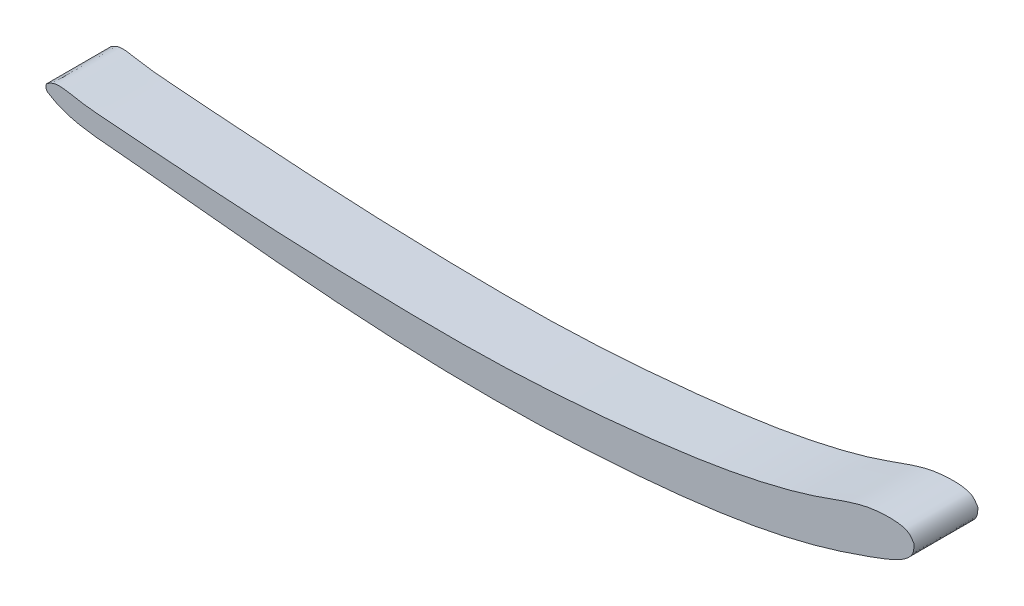
ISO-10303-21;
HEADER;
FILE_DESCRIPTION(('STEP AP214'),'2;1');
FILE_NAME('part.step','',(''),(''),'','','');
FILE_SCHEMA(('AUTOMOTIVE_DESIGN { 1 0 10303 214 1 1 1 1 }'));
ENDSEC;
DATA;
#1=APPLICATION_CONTEXT('core data for automotive mechanical design processes');
#2=APPLICATION_PROTOCOL_DEFINITION('international standard','automotive_design',2000,#1);
#3=PRODUCT_CONTEXT('',#1,'mechanical');
#4=PRODUCT('Part','Part','',(#3));
#5=PRODUCT_RELATED_PRODUCT_CATEGORY('part','',(#4));
#6=PRODUCT_DEFINITION_FORMATION('','',#4);
#7=PRODUCT_DEFINITION_CONTEXT('part definition',#1,'design');
#8=PRODUCT_DEFINITION('design','',#6,#7);
#9=PRODUCT_DEFINITION_SHAPE('','',#8);
#10=(LENGTH_UNIT() NAMED_UNIT(*) SI_UNIT(.MILLI.,.METRE.));
#11=(NAMED_UNIT(*) PLANE_ANGLE_UNIT() SI_UNIT($,.RADIAN.));
#12=(NAMED_UNIT(*) SI_UNIT($,.STERADIAN.) SOLID_ANGLE_UNIT());
#13=UNCERTAINTY_MEASURE_WITH_UNIT(LENGTH_MEASURE(1.E-05),#10,'distance_accuracy_value','');
#14=(GEOMETRIC_REPRESENTATION_CONTEXT(3) GLOBAL_UNCERTAINTY_ASSIGNED_CONTEXT((#13)) GLOBAL_UNIT_ASSIGNED_CONTEXT((#10,
#11,#12)) REPRESENTATION_CONTEXT('',''));
#15=CARTESIAN_POINT('',(0.,0.,0.));
#16=DIRECTION('',(0.,0.,1.));
#17=DIRECTION('',(1.,0.,0.));
#18=AXIS2_PLACEMENT_3D('',#15,#16,#17);
#19=CARTESIAN_POINT('',(34.1995778875413,0.,500.));
#20=CARTESIAN_POINT('',(34.1874813285654,0.0741571357158952,500.));
#21=CARTESIAN_POINT('',(34.1490713328175,0.13840808758348,500.));
#22=CARTESIAN_POINT('',(34.0670669104085,0.261769965343075,500.));
#23=CARTESIAN_POINT('',(34.0224269057015,0.320842682544746,500.));
#24=CARTESIAN_POINT('',(33.8922904429288,0.500773561147624,500.));
#25=CARTESIAN_POINT('',(33.8061629966007,0.622384964092101,500.));
#26=CARTESIAN_POINT('',(33.6583384786526,0.785972443255624,500.));
#27=CARTESIAN_POINT('',(33.6063756755256,0.837554506767193,500.));
#28=CARTESIAN_POINT('',(33.4930811316728,0.930446486385414,500.));
#29=CARTESIAN_POINT('',(33.431772280643,0.972229789627332,500.));
#30=CARTESIAN_POINT('',(33.2380043852679,1.08391297511042,500.));
#31=CARTESIAN_POINT('',(33.1011292363777,1.13776827244978,500.));
#32=CARTESIAN_POINT('',(32.8200630394304,1.22589754144731,500.));
#33=CARTESIAN_POINT('',(32.6751175430625,1.25961769236968,500.));
#34=CARTESIAN_POINT('',(32.3858796108614,1.31563568482755,500.));
#35=CARTESIAN_POINT('',(32.2408938488102,1.33766287733427,500.));
#36=CARTESIAN_POINT('',(31.8049703763168,1.38798763683787,500.));
#37=CARTESIAN_POINT('',(31.5131538922444,1.40195393501162,500.));
#38=CARTESIAN_POINT('',(30.6360094049062,1.41620975610783,500.));
#39=CARTESIAN_POINT('',(30.0463338100498,1.38358651665251,500.));
#40=CARTESIAN_POINT('',(28.8883069536911,1.25425631075958,500.));
#41=CARTESIAN_POINT('',(28.317318555301,1.1551242489294,500.));
#42=CARTESIAN_POINT('',(26.6269692637372,0.760594290704174,500.));
#43=CARTESIAN_POINT('',(25.5281064793509,0.376899607159791,500.));
#44=CARTESIAN_POINT('',(23.3345459244747,-0.407280279158796,500.));
#45=CARTESIAN_POINT('',(22.2375416366106,-0.798545814213202,500.));
#46=CARTESIAN_POINT('',(20.0214661746644,-1.49986584351742,500.));
#47=CARTESIAN_POINT('',(18.9034482828317,-1.81379665030557,500.));
#48=CARTESIAN_POINT('',(16.6539234494487,-2.39201556594072,500.));
#49=CARTESIAN_POINT('',(15.5224954133711,-2.65659406444642,500.));
#50=CARTESIAN_POINT('',(13.2499481762186,-3.15008542253328,500.));
#51=CARTESIAN_POINT('',(12.1078501669701,-3.37776347097258,500.));
#52=CARTESIAN_POINT('',(9.81650413804612,-3.79466538899071,500.));
#53=CARTESIAN_POINT('',(8.6678163789483,-3.98442612028832,500.));
#54=CARTESIAN_POINT('',(5.21487502532517,-4.51106695368619,500.));
#55=CARTESIAN_POINT('',(2.904271999959,-4.80785701717446,500.));
#56=CARTESIAN_POINT('',(-1.72222017460147,-5.33257058855151,500.));
#57=CARTESIAN_POINT('',(-4.03930713412837,-5.5585515903216,500.));
#58=CARTESIAN_POINT('',(-8.67976993270897,-5.95095344500343,500.));
#59=CARTESIAN_POINT('',(-11.0029261154576,-6.11728218282928,500.));
#60=CARTESIAN_POINT('',(-15.6535301034458,-6.36980949981099,500.));
#61=CARTESIAN_POINT('',(-17.9807486229762,-6.45415249060454,500.));
#62=CARTESIAN_POINT('',(-22.6353921284961,-6.54005482229968,500.));
#63=CARTESIAN_POINT('',(-24.9633319017496,-6.54271353338305,500.));
#64=CARTESIAN_POINT('',(-29.6199574246909,-6.4993962872005,500.));
#65=CARTESIAN_POINT('',(-31.9480012842038,-6.45457464965949,500.));
#66=CARTESIAN_POINT('',(-36.6029946731399,-6.33512770237996,500.));
#67=CARTESIAN_POINT('',(-38.9300863805939,-6.25977638664432,500.));
#68=CARTESIAN_POINT('',(-43.5832300671694,-6.07011090681149,500.));
#69=CARTESIAN_POINT('',(-45.9086929871883,-5.95528333120081,500.));
#70=CARTESIAN_POINT('',(-50.5576862047214,-5.69078134203213,500.));
#71=CARTESIAN_POINT('',(-52.8812159923354,-5.54075788338781,500.));
#72=CARTESIAN_POINT('',(-57.5272535884346,-5.22376764565039,500.));
#73=CARTESIAN_POINT('',(-59.8498772486189,-5.05948412251316,500.));
#74=CARTESIAN_POINT('',(-63.3333771032869,-4.80712769401496,500.));
#75=CARTESIAN_POINT('',(-64.4944893067893,-4.72218998849382,500.));
#76=CARTESIAN_POINT('',(-66.2356211125848,-4.58780102106562,500.));
#77=CARTESIAN_POINT('',(-66.8160766996518,-4.5440144645485,500.));
#78=CARTESIAN_POINT('',(-67.9765592301273,-4.45091481628392,500.));
#79=CARTESIAN_POINT('',(-68.556438439243,-4.40012974311152,500.));
#80=CARTESIAN_POINT('',(-69.7123307053046,-4.27102987390579,500.));
#81=CARTESIAN_POINT('',(-70.2881261635156,-4.19047959962665,500.));
#82=CARTESIAN_POINT('',(-71.4344090819607,-3.98988922682933,500.));
#83=CARTESIAN_POINT('',(-72.004321220128,-3.86129111023334,500.));
#84=CARTESIAN_POINT('',(-72.7259862169622,-3.79088028654653,500.));
#85=CARTESIAN_POINT('',(-72.8707958816091,-3.78156634380131,500.));
#86=CARTESIAN_POINT('',(-73.1621886984229,-3.78067917186592,500.));
#87=CARTESIAN_POINT('',(-73.309972286056,-3.78944310818853,500.));
#88=CARTESIAN_POINT('',(-73.5966568692457,-3.83520368189902,500.));
#89=CARTESIAN_POINT('',(-73.7360526749672,-3.87363888480925,500.));
#90=CARTESIAN_POINT('',(-74.0075213592592,-3.97937231479174,500.));
#91=CARTESIAN_POINT('',(-74.1402427524666,-4.04404252181508,500.));
#92=CARTESIAN_POINT('',(-74.3334160337373,-4.14966036286305,500.));
#93=CARTESIAN_POINT('',(-74.3979635506139,-4.18480252705447,500.));
#94=CARTESIAN_POINT('',(-74.5234677163425,-4.26066131397356,500.));
#95=CARTESIAN_POINT('',(-74.5828494787811,-4.30761139172931,500.));
#96=CARTESIAN_POINT('',(-74.6609673659758,-4.4319610009341,500.));
#97=CARTESIAN_POINT('',(-74.6813251518381,-4.50556003187921,500.));
#98=CARTESIAN_POINT('',(-74.6923480475405,-4.65157211615872,500.));
#99=CARTESIAN_POINT('',(-74.6895516992239,-4.7243309736979,500.));
#100=CARTESIAN_POINT('',(-74.6788989196528,-4.86969813445905,500.));
#101=CARTESIAN_POINT('',(-74.668139848164,-4.94372736458604,500.));
#102=CARTESIAN_POINT('',(-74.6264870520148,-5.04509981770742,500.));
#103=CARTESIAN_POINT('',(-74.6078102895096,-5.07779114265865,500.));
#104=CARTESIAN_POINT('',(-74.5608192788146,-5.13352929427748,500.));
#105=CARTESIAN_POINT('',(-74.532611679081,-5.15768192241098,500.));
#106=CARTESIAN_POINT('',(-74.4430777962982,-5.2219073511809,500.));
#107=CARTESIAN_POINT('',(-74.3772893413366,-5.25468037819582,500.));
#108=CARTESIAN_POINT('',(-74.2481047642209,-5.32417308069124,500.));
#109=CARTESIAN_POINT('',(-74.1844663882424,-5.3605391002345,500.));
#110=CARTESIAN_POINT('',(-73.9951443418758,-5.4723420856737,500.));
#111=CARTESIAN_POINT('',(-73.8710856702942,-5.5505381713297,500.));
#112=CARTESIAN_POINT('',(-73.6201018670925,-5.70206331966131,500.));
#113=CARTESIAN_POINT('',(-73.4920684790238,-5.7742666776784,500.));
#114=CARTESIAN_POINT('',(-73.1013475619121,-5.97091556830298,500.));
#115=CARTESIAN_POINT('',(-72.8333308319445,-6.07986969028638,500.));
#116=CARTESIAN_POINT('',(-72.0182882758319,-6.37443061757338,500.));
#117=CARTESIAN_POINT('',(-71.4612663548546,-6.5306635612409,500.));
#118=CARTESIAN_POINT('',(-70.3258907585958,-6.78044536945313,500.));
#119=CARTESIAN_POINT('',(-69.7533527679786,-6.87273838720681,500.));
#120=CARTESIAN_POINT('',(-68.6055513402863,-7.02827715609403,500.));
#121=CARTESIAN_POINT('',(-68.0299077251518,-7.09182400113816,500.));
#122=CARTESIAN_POINT('',(-66.3007691330595,-7.26444873441393,500.));
#123=CARTESIAN_POINT('',(-65.1457066261008,-7.36059728445502,500.));
#124=CARTESIAN_POINT('',(-62.8369053584323,-7.56423781101556,500.));
#125=CARTESIAN_POINT('',(-61.6828756747125,-7.66989138515665,500.));
#126=CARTESIAN_POINT('',(-58.2224293769129,-8.00382793277056,500.));
#127=CARTESIAN_POINT('',(-55.9171821646789,-8.24419737220536,500.));
#128=CARTESIAN_POINT('',(-51.3061171017263,-8.71903038565401,500.));
#129=CARTESIAN_POINT('',(-49.0002018579866,-8.95245892690511,500.));
#130=CARTESIAN_POINT('',(-42.0772680838738,-9.59868373812577,500.));
#131=CARTESIAN_POINT('',(-37.455403209382,-9.95943646448891,500.));
#132=CARTESIAN_POINT('',(-28.1977025809699,-10.4568239930453,500.));
#133=CARTESIAN_POINT('',(-23.5663225716106,-10.5942605358358,500.));
#134=CARTESIAN_POINT('',(-14.3040095336271,-10.5819342106095,500.));
#135=CARTESIAN_POINT('',(-9.66941102082347,-10.4291598004046,500.));
#136=CARTESIAN_POINT('',(-2.72831164768134,-9.99776496287773,500.));
#137=CARTESIAN_POINT('',(-0.417017369929204,-9.81960014090164,500.));
#138=CARTESIAN_POINT('',(4.19799265549567,-9.3897204803448,500.));
#139=CARTESIAN_POINT('',(6.50300067125496,-9.13715182507904,500.));
#140=CARTESIAN_POINT('',(11.0975962838027,-8.52129011896802,500.));
#141=CARTESIAN_POINT('',(13.3861346327319,-8.15877887125143,500.));
#142=CARTESIAN_POINT('',(17.9365068379527,-7.26736002385013,500.));
#143=CARTESIAN_POINT('',(20.1937021354319,-6.73565870195262,500.));
#144=CARTESIAN_POINT('',(24.6579181948228,-5.47664414494539,500.));
#145=CARTESIAN_POINT('',(26.861509206722,-4.75069154985809,500.));
#146=CARTESIAN_POINT('',(29.5826096719977,-3.75100913297273,500.));
#147=CARTESIAN_POINT('',(30.1252307276895,-3.54660427705274,500.));
#148=CARTESIAN_POINT('',(30.9316698912432,-3.22128624821074,500.));
#149=CARTESIAN_POINT('',(31.1992281461409,-3.10904090198083,500.));
#150=CARTESIAN_POINT('',(31.7280527359634,-2.87217816029133,500.));
#151=CARTESIAN_POINT('',(31.9895722762998,-2.74821732415236,500.));
#152=CARTESIAN_POINT('',(32.5000014192767,-2.47619190886814,500.));
#153=CARTESIAN_POINT('',(32.7497547736231,-2.32774895818354,500.));
#154=CARTESIAN_POINT('',(33.2238448690163,-1.99103689775557,500.));
#155=CARTESIAN_POINT('',(33.4461694765174,-1.80211132170365,500.));
#156=CARTESIAN_POINT('',(33.7397567184468,-1.48004596168142,500.));
#157=CARTESIAN_POINT('',(33.8302373019427,-1.36718255878074,500.));
#158=CARTESIAN_POINT('',(33.9861462435594,-1.12276191480029,500.));
#159=CARTESIAN_POINT('',(34.0520506075065,-0.989330696318078,500.));
#160=CARTESIAN_POINT('',(34.1284222094314,-0.71420655519165,500.));
#161=CARTESIAN_POINT('',(34.1405878643794,-0.570658798261792,500.));
#162=CARTESIAN_POINT('',(34.1634085547602,-0.356388955690517,500.));
#163=CARTESIAN_POINT('',(34.1743487538201,-0.285553916009989,500.));
#164=CARTESIAN_POINT('',(34.1972462429556,-0.143808913003066,500.));
#165=CARTESIAN_POINT('',(34.2116744465171,-0.0741571357158917,500.));
#166=CARTESIAN_POINT('',(34.1995778875413,0.,500.));
#167=B_SPLINE_CURVE_WITH_KNOTS('',3,(#19,#20,#21,#22,#23,#24,#25,#26,#27,#28,#29,#30,#31,#32,
#33,#34,#35,#36,#37,#38,#39,#40,#41,#42,#43,#44,#45,#46,#47,#48,#49,#50,#51,#52,#53,#54,#55,#56,
#57,#58,#59,#60,#61,#62,#63,#64,#65,#66,#67,#68,#69,#70,#71,#72,#73,#74,#75,#76,#77,#78,#79,#80,
#81,#82,#83,#84,#85,#86,#87,#88,#89,#90,#91,#92,#93,#94,#95,#96,#97,#98,#99,#100,#101,#102,#103,
#104,#105,#106,#107,#108,#109,#110,#111,#112,#113,#114,#115,#116,#117,#118,#119,#120,#121,#122,
#123,#124,#125,#126,#127,#128,#129,#130,#131,#132,#133,#134,#135,#136,#137,#138,#139,#140,#141,
#142,#143,#144,#145,#146,#147,#148,#149,#150,#151,#152,#153,#154,#155,#156,#157,#158,#159,#160,
#161,#162,#163,#164,#165,#166),.UNSPECIFIED.,.T.,.F.,(4,2,2,2,2,2,2,2,2,2,2,2,2,2,2,2,2,2,2,2,2,
2,2,2,2,2,2,2,2,2,2,2,2,2,2,2,2,2,2,2,2,2,2,2,2,2,2,2,2,2,2,2,2,2,2,2,2,2,2,2,2,2,2,2,2,2,2,2,2,
2,2,2,2,4),(0.,0.000976562500000146,0.00195312500000029,0.00390625000000053,0.00488281250000065,
0.00585937500000077,0.00781250000000101,0.00976562500000125,0.0117187500000015,
0.015625000000002,0.023437500000003,0.031250000000004,0.046875000000006,0.062500000000008,
0.07812500000001,0.093750000000012,0.109375000000014,0.125000000000016,0.15625000000002,
0.187500000000024,0.218750000000028,0.250000000000032,0.281250000000036,0.31250000000004,
0.343750000000044,0.375000000000048,0.406250000000052,0.437500000000056,0.453125000000058,
0.460937500000059,0.468750000000059,0.47656250000006,0.484375000000061,0.486328125000061,
0.488281250000061,0.490234375000062,0.492187500000062,0.493164062500062,0.494140625000062,
0.495117187500062,0.496093750000062,0.497070312500062,0.497558593750062,0.498046875000062,
0.499023437500062,0.500000000000062,0.501953125000062,0.503906250000062,0.507812500000061,
0.51562500000006,0.523437500000059,0.531250000000058,0.546875000000056,0.562500000000054,
0.593750000000051,0.625000000000047,0.687500000000039,0.750000000000031,0.812500000000024,
0.84375000000002,0.875000000000016,0.906250000000012,0.937500000000008,0.968750000000004,
0.976562500000003,0.980468750000003,0.984375000000002,0.988281250000002,0.992187500000001,
0.994140625000001,0.996093750000001,0.998046875,0.9990234375,1.),.UNSPECIFIED.);
#168=DIRECTION('',(0.,0.,-1.));
#169=VECTOR('',#168,1.);
#170=SURFACE_OF_LINEAR_EXTRUSION('',#167,#169);
#171=CARTESIAN_POINT('',(34.1995778875413,0.,500.));
#172=CARTESIAN_POINT('',(34.2116744465171,-0.0741571357158917,500.));
#173=CARTESIAN_POINT('',(34.1972462429556,-0.143808913003066,500.));
#174=CARTESIAN_POINT('',(34.1743487538201,-0.285553916009989,500.));
#175=CARTESIAN_POINT('',(34.1634085547602,-0.356388955690517,500.));
#176=CARTESIAN_POINT('',(34.1405878643794,-0.570658798261792,500.));
#177=CARTESIAN_POINT('',(34.1284222094314,-0.71420655519165,500.));
#178=CARTESIAN_POINT('',(34.0520506075065,-0.989330696318078,500.));
#179=CARTESIAN_POINT('',(33.9861462435594,-1.12276191480029,500.));
#180=CARTESIAN_POINT('',(33.8302373019427,-1.36718255878074,500.));
#181=CARTESIAN_POINT('',(33.7397567184468,-1.48004596168142,500.));
#182=CARTESIAN_POINT('',(33.4461694765174,-1.80211132170365,500.));
#183=CARTESIAN_POINT('',(33.2238448690163,-1.99103689775557,500.));
#184=CARTESIAN_POINT('',(32.7497547736231,-2.32774895818354,500.));
#185=CARTESIAN_POINT('',(32.5000014192767,-2.47619190886814,500.));
#186=CARTESIAN_POINT('',(31.9895722762998,-2.74821732415236,500.));
#187=CARTESIAN_POINT('',(31.7280527359634,-2.87217816029133,500.));
#188=CARTESIAN_POINT('',(31.1992281461409,-3.10904090198083,500.));
#189=CARTESIAN_POINT('',(30.9316698912432,-3.22128624821074,500.));
#190=CARTESIAN_POINT('',(30.1252307276895,-3.54660427705274,500.));
#191=CARTESIAN_POINT('',(29.5826096719977,-3.75100913297273,500.));
#192=CARTESIAN_POINT('',(26.861509206722,-4.75069154985809,500.));
#193=CARTESIAN_POINT('',(24.6579181948228,-5.47664414494539,500.));
#194=CARTESIAN_POINT('',(20.1937021354319,-6.73565870195262,500.));
#195=CARTESIAN_POINT('',(17.9365068379527,-7.26736002385013,500.));
#196=CARTESIAN_POINT('',(13.3861346327319,-8.15877887125143,500.));
#197=CARTESIAN_POINT('',(11.0975962838027,-8.52129011896802,500.));
#198=CARTESIAN_POINT('',(6.50300067125496,-9.13715182507904,500.));
#199=CARTESIAN_POINT('',(4.19799265549567,-9.3897204803448,500.));
#200=CARTESIAN_POINT('',(-0.417017369929204,-9.81960014090164,500.));
#201=CARTESIAN_POINT('',(-2.72831164768134,-9.99776496287773,500.));
#202=CARTESIAN_POINT('',(-9.66941102082347,-10.4291598004046,500.));
#203=CARTESIAN_POINT('',(-14.3040095336271,-10.5819342106095,500.));
#204=CARTESIAN_POINT('',(-23.5663225716106,-10.5942605358358,500.));
#205=CARTESIAN_POINT('',(-28.1977025809699,-10.4568239930453,500.));
#206=CARTESIAN_POINT('',(-37.455403209382,-9.95943646448891,500.));
#207=CARTESIAN_POINT('',(-42.0772680838738,-9.59868373812577,500.));
#208=CARTESIAN_POINT('',(-49.0002018579866,-8.95245892690511,500.));
#209=CARTESIAN_POINT('',(-51.3061171017263,-8.71903038565401,500.));
#210=CARTESIAN_POINT('',(-55.9171821646789,-8.24419737220536,500.));
#211=CARTESIAN_POINT('',(-58.2224293769129,-8.00382793277056,500.));
#212=CARTESIAN_POINT('',(-61.6828756747125,-7.66989138515665,500.));
#213=CARTESIAN_POINT('',(-62.8369053584323,-7.56423781101556,500.));
#214=CARTESIAN_POINT('',(-65.1457066261008,-7.36059728445502,500.));
#215=CARTESIAN_POINT('',(-66.3007691330595,-7.26444873441393,500.));
#216=CARTESIAN_POINT('',(-68.0299077251518,-7.09182400113816,500.));
#217=CARTESIAN_POINT('',(-68.6055513402863,-7.02827715609403,500.));
#218=CARTESIAN_POINT('',(-69.7533527679786,-6.87273838720681,500.));
#219=CARTESIAN_POINT('',(-70.3258907585958,-6.78044536945313,500.));
#220=CARTESIAN_POINT('',(-71.4612663548546,-6.5306635612409,500.));
#221=CARTESIAN_POINT('',(-72.0182882758319,-6.37443061757338,500.));
#222=CARTESIAN_POINT('',(-72.8333308319445,-6.07986969028638,500.));
#223=CARTESIAN_POINT('',(-73.1013475619121,-5.97091556830298,500.));
#224=CARTESIAN_POINT('',(-73.4920684790238,-5.7742666776784,500.));
#225=CARTESIAN_POINT('',(-73.6201018670925,-5.70206331966131,500.));
#226=CARTESIAN_POINT('',(-73.8710856702942,-5.5505381713297,500.));
#227=CARTESIAN_POINT('',(-73.9951443418758,-5.4723420856737,500.));
#228=CARTESIAN_POINT('',(-74.1844663882424,-5.3605391002345,500.));
#229=CARTESIAN_POINT('',(-74.2481047642209,-5.32417308069124,500.));
#230=CARTESIAN_POINT('',(-74.3772893413366,-5.25468037819582,500.));
#231=CARTESIAN_POINT('',(-74.4430777962982,-5.2219073511809,500.));
#232=CARTESIAN_POINT('',(-74.532611679081,-5.15768192241098,500.));
#233=CARTESIAN_POINT('',(-74.5608192788146,-5.13352929427748,500.));
#234=CARTESIAN_POINT('',(-74.6078102895096,-5.07779114265865,500.));
#235=CARTESIAN_POINT('',(-74.6264870520148,-5.04509981770742,500.));
#236=CARTESIAN_POINT('',(-74.668139848164,-4.94372736458604,500.));
#237=CARTESIAN_POINT('',(-74.6788989196528,-4.86969813445905,500.));
#238=CARTESIAN_POINT('',(-74.6895516992239,-4.7243309736979,500.));
#239=CARTESIAN_POINT('',(-74.6923480475405,-4.65157211615872,500.));
#240=CARTESIAN_POINT('',(-74.6813251518381,-4.50556003187921,500.));
#241=CARTESIAN_POINT('',(-74.6609673659758,-4.4319610009341,500.));
#242=CARTESIAN_POINT('',(-74.5828494787811,-4.30761139172931,500.));
#243=CARTESIAN_POINT('',(-74.5234677163425,-4.26066131397356,500.));
#244=CARTESIAN_POINT('',(-74.3979635506139,-4.18480252705447,500.));
#245=CARTESIAN_POINT('',(-74.3334160337373,-4.14966036286305,500.));
#246=CARTESIAN_POINT('',(-74.1402427524666,-4.04404252181508,500.));
#247=CARTESIAN_POINT('',(-74.0075213592592,-3.97937231479174,500.));
#248=CARTESIAN_POINT('',(-73.7360526749672,-3.87363888480925,500.));
#249=CARTESIAN_POINT('',(-73.5966568692457,-3.83520368189902,500.));
#250=CARTESIAN_POINT('',(-73.309972286056,-3.78944310818853,500.));
#251=CARTESIAN_POINT('',(-73.1621886984229,-3.78067917186592,500.));
#252=CARTESIAN_POINT('',(-72.8707958816091,-3.78156634380131,500.));
#253=CARTESIAN_POINT('',(-72.7259862169622,-3.79088028654653,500.));
#254=CARTESIAN_POINT('',(-72.004321220128,-3.86129111023334,500.));
#255=CARTESIAN_POINT('',(-71.4344090819607,-3.98988922682933,500.));
#256=CARTESIAN_POINT('',(-70.2881261635156,-4.19047959962665,500.));
#257=CARTESIAN_POINT('',(-69.7123307053046,-4.27102987390579,500.));
#258=CARTESIAN_POINT('',(-68.556438439243,-4.40012974311152,500.));
#259=CARTESIAN_POINT('',(-67.9765592301273,-4.45091481628392,500.));
#260=CARTESIAN_POINT('',(-66.8160766996518,-4.5440144645485,500.));
#261=CARTESIAN_POINT('',(-66.2356211125848,-4.58780102106562,500.));
#262=CARTESIAN_POINT('',(-64.4944893067893,-4.72218998849382,500.));
#263=CARTESIAN_POINT('',(-63.3333771032869,-4.80712769401496,500.));
#264=CARTESIAN_POINT('',(-59.8498772486189,-5.05948412251316,500.));
#265=CARTESIAN_POINT('',(-57.5272535884346,-5.22376764565039,500.));
#266=CARTESIAN_POINT('',(-52.8812159923354,-5.54075788338781,500.));
#267=CARTESIAN_POINT('',(-50.5576862047214,-5.69078134203213,500.));
#268=CARTESIAN_POINT('',(-45.9086929871883,-5.95528333120081,500.));
#269=CARTESIAN_POINT('',(-43.5832300671694,-6.07011090681149,500.));
#270=CARTESIAN_POINT('',(-38.9300863805939,-6.25977638664432,500.));
#271=CARTESIAN_POINT('',(-36.6029946731399,-6.33512770237996,500.));
#272=CARTESIAN_POINT('',(-31.9480012842038,-6.45457464965949,500.));
#273=CARTESIAN_POINT('',(-29.6199574246909,-6.4993962872005,500.));
#274=CARTESIAN_POINT('',(-24.9633319017496,-6.54271353338305,500.));
#275=CARTESIAN_POINT('',(-22.6353921284961,-6.54005482229968,500.));
#276=CARTESIAN_POINT('',(-17.9807486229762,-6.45415249060454,500.));
#277=CARTESIAN_POINT('',(-15.6535301034458,-6.36980949981099,500.));
#278=CARTESIAN_POINT('',(-11.0029261154576,-6.11728218282928,500.));
#279=CARTESIAN_POINT('',(-8.67976993270897,-5.95095344500343,500.));
#280=CARTESIAN_POINT('',(-4.03930713412837,-5.5585515903216,500.));
#281=CARTESIAN_POINT('',(-1.72222017460147,-5.33257058855151,500.));
#282=CARTESIAN_POINT('',(2.904271999959,-4.80785701717446,500.));
#283=CARTESIAN_POINT('',(5.21487502532517,-4.51106695368619,500.));
#284=CARTESIAN_POINT('',(8.6678163789483,-3.98442612028832,500.));
#285=CARTESIAN_POINT('',(9.81650413804612,-3.79466538899071,500.));
#286=CARTESIAN_POINT('',(12.1078501669701,-3.37776347097258,500.));
#287=CARTESIAN_POINT('',(13.2499481762186,-3.15008542253328,500.));
#288=CARTESIAN_POINT('',(15.5224954133711,-2.65659406444642,500.));
#289=CARTESIAN_POINT('',(16.6539234494487,-2.39201556594072,500.));
#290=CARTESIAN_POINT('',(18.9034482828317,-1.81379665030557,500.));
#291=CARTESIAN_POINT('',(20.0214661746644,-1.49986584351742,500.));
#292=CARTESIAN_POINT('',(22.2375416366106,-0.798545814213202,500.));
#293=CARTESIAN_POINT('',(23.3345459244747,-0.407280279158796,500.));
#294=CARTESIAN_POINT('',(25.5281064793509,0.376899607159791,500.));
#295=CARTESIAN_POINT('',(26.6269692637372,0.760594290704174,500.));
#296=CARTESIAN_POINT('',(28.317318555301,1.1551242489294,500.));
#297=CARTESIAN_POINT('',(28.8883069536911,1.25425631075958,500.));
#298=CARTESIAN_POINT('',(30.0463338100498,1.38358651665251,500.));
#299=CARTESIAN_POINT('',(30.6360094049062,1.41620975610783,500.));
#300=CARTESIAN_POINT('',(31.5131538922444,1.40195393501162,500.));
#301=CARTESIAN_POINT('',(31.8049703763168,1.38798763683787,500.));
#302=CARTESIAN_POINT('',(32.2408938488102,1.33766287733427,500.));
#303=CARTESIAN_POINT('',(32.3858796108614,1.31563568482755,500.));
#304=CARTESIAN_POINT('',(32.6751175430625,1.25961769236968,500.));
#305=CARTESIAN_POINT('',(32.8200630394304,1.22589754144731,500.));
#306=CARTESIAN_POINT('',(33.1011292363777,1.13776827244978,500.));
#307=CARTESIAN_POINT('',(33.2380043852679,1.08391297511042,500.));
#308=CARTESIAN_POINT('',(33.431772280643,0.972229789627332,500.));
#309=CARTESIAN_POINT('',(33.4930811316728,0.930446486385414,500.));
#310=CARTESIAN_POINT('',(33.6063756755256,0.837554506767193,500.));
#311=CARTESIAN_POINT('',(33.6583384786526,0.785972443255624,500.));
#312=CARTESIAN_POINT('',(33.8061629966007,0.622384964092101,500.));
#313=CARTESIAN_POINT('',(33.8922904429288,0.500773561147624,500.));
#314=CARTESIAN_POINT('',(34.0224269057015,0.320842682544746,500.));
#315=CARTESIAN_POINT('',(34.0670669104085,0.261769965343075,500.));
#316=CARTESIAN_POINT('',(34.1490713328175,0.13840808758348,500.));
#317=CARTESIAN_POINT('',(34.1874813285654,0.0741571357158952,500.));
#318=CARTESIAN_POINT('',(34.1995778875413,0.,500.));
#319=B_SPLINE_CURVE_WITH_KNOTS('',3,(#171,#172,#173,#174,#175,#176,#177,#178,#179,#180,#181,
#182,#183,#184,#185,#186,#187,#188,#189,#190,#191,#192,#193,#194,#195,#196,#197,#198,#199,#200,
#201,#202,#203,#204,#205,#206,#207,#208,#209,#210,#211,#212,#213,#214,#215,#216,#217,#218,#219,
#220,#221,#222,#223,#224,#225,#226,#227,#228,#229,#230,#231,#232,#233,#234,#235,#236,#237,#238,
#239,#240,#241,#242,#243,#244,#245,#246,#247,#248,#249,#250,#251,#252,#253,#254,#255,#256,#257,
#258,#259,#260,#261,#262,#263,#264,#265,#266,#267,#268,#269,#270,#271,#272,#273,#274,#275,#276,
#277,#278,#279,#280,#281,#282,#283,#284,#285,#286,#287,#288,#289,#290,#291,#292,#293,#294,#295,
#296,#297,#298,#299,#300,#301,#302,#303,#304,#305,#306,#307,#308,#309,#310,#311,#312,#313,#314,
#315,#316,#317,#318),.UNSPECIFIED.,.T.,.F.,(4,2,2,2,2,2,2,2,2,2,2,2,2,2,2,2,2,2,2,2,2,2,2,2,2,2,
2,2,2,2,2,2,2,2,2,2,2,2,2,2,2,2,2,2,2,2,2,2,2,2,2,2,2,2,2,2,2,2,2,2,2,2,2,2,2,2,2,2,2,2,2,2,2,
4),(0.,0.000976562499999778,0.00195312499999967,0.00390624999999933,0.00585937499999911,
0.00781249999999889,0.0117187499999983,0.0156249999999978,0.0195312499999972,0.0234374999999968,
0.0312499999999958,0.0624999999999919,0.0937499999999881,0.124999999999984,0.15624999999998,
0.187499999999976,0.249999999999969,0.312499999999961,0.374999999999953,0.406249999999949,
0.437499999999946,0.453124999999944,0.468749999999942,0.476562499999941,0.48437499999994,
0.492187499999939,0.496093749999938,0.498046874999938,0.499999999999938,0.500976562499938,
0.501953124999938,0.502441406249938,0.502929687499938,0.503906249999938,0.504882812499938,
0.505859374999938,0.506835937499938,0.507812499999938,0.509765624999938,0.511718749999938,
0.513671874999939,0.515624999999939,0.52343749999994,0.531249999999941,0.539062499999941,
0.546874999999942,0.562499999999944,0.593749999999948,0.624999999999952,0.656249999999956,
0.68749999999996,0.718749999999964,0.749999999999968,0.781249999999972,0.812499999999976,
0.84374999999998,0.874999999999984,0.890624999999986,0.906249999999988,0.92187499999999,
0.937499999999992,0.953124999999994,0.968749999999996,0.976562499999997,0.984374999999998,
0.988281249999999,0.990234374999999,0.992187499999999,0.994140624999999,0.995117187499999,
0.996093749999999,0.998046875,0.9990234375,1.),.UNSPECIFIED.);
#320=CARTESIAN_POINT('',(34.1995778875413,0.,500.));
#321=VERTEX_POINT('',#320);
#322=EDGE_CURVE('E10',#321,#321,#319,.F.);
#323=ORIENTED_EDGE('',*,*,#322,.F.);
#324=EDGE_LOOP('',(#323));
#325=FACE_BOUND('',#324,.T.);
#326=CARTESIAN_POINT('',(34.1995778875413,0.,492.));
#327=CARTESIAN_POINT('',(34.1874813285654,0.0741571357158952,492.));
#328=CARTESIAN_POINT('',(34.1490713328175,0.13840808758348,492.));
#329=CARTESIAN_POINT('',(34.0670669104085,0.261769965343075,492.));
#330=CARTESIAN_POINT('',(34.0224269057015,0.320842682544746,492.));
#331=CARTESIAN_POINT('',(33.8922904429288,0.500773561147624,492.));
#332=CARTESIAN_POINT('',(33.8061629966007,0.622384964092101,492.));
#333=CARTESIAN_POINT('',(33.6583384786526,0.785972443255624,492.));
#334=CARTESIAN_POINT('',(33.6063756755256,0.837554506767193,492.));
#335=CARTESIAN_POINT('',(33.4930811316728,0.930446486385414,492.));
#336=CARTESIAN_POINT('',(33.431772280643,0.972229789627332,492.));
#337=CARTESIAN_POINT('',(33.2380043852679,1.08391297511042,492.));
#338=CARTESIAN_POINT('',(33.1011292363777,1.13776827244978,492.));
#339=CARTESIAN_POINT('',(32.8200630394304,1.22589754144731,492.));
#340=CARTESIAN_POINT('',(32.6751175430625,1.25961769236968,492.));
#341=CARTESIAN_POINT('',(32.3858796108614,1.31563568482755,492.));
#342=CARTESIAN_POINT('',(32.2408938488102,1.33766287733427,492.));
#343=CARTESIAN_POINT('',(31.8049703763168,1.38798763683787,492.));
#344=CARTESIAN_POINT('',(31.5131538922444,1.40195393501162,492.));
#345=CARTESIAN_POINT('',(30.6360094049062,1.41620975610783,492.));
#346=CARTESIAN_POINT('',(30.0463338100498,1.38358651665251,492.));
#347=CARTESIAN_POINT('',(28.8883069536911,1.25425631075958,492.));
#348=CARTESIAN_POINT('',(28.317318555301,1.1551242489294,492.));
#349=CARTESIAN_POINT('',(26.6269692637372,0.760594290704174,492.));
#350=CARTESIAN_POINT('',(25.5281064793509,0.376899607159791,492.));
#351=CARTESIAN_POINT('',(23.3345459244747,-0.407280279158796,492.));
#352=CARTESIAN_POINT('',(22.2375416366106,-0.798545814213202,492.));
#353=CARTESIAN_POINT('',(20.0214661746644,-1.49986584351742,492.));
#354=CARTESIAN_POINT('',(18.9034482828317,-1.81379665030557,492.));
#355=CARTESIAN_POINT('',(16.6539234494487,-2.39201556594072,492.));
#356=CARTESIAN_POINT('',(15.5224954133711,-2.65659406444642,492.));
#357=CARTESIAN_POINT('',(13.2499481762186,-3.15008542253328,492.));
#358=CARTESIAN_POINT('',(12.1078501669701,-3.37776347097258,492.));
#359=CARTESIAN_POINT('',(9.81650413804612,-3.79466538899071,492.));
#360=CARTESIAN_POINT('',(8.6678163789483,-3.98442612028832,492.));
#361=CARTESIAN_POINT('',(5.21487502532517,-4.51106695368619,492.));
#362=CARTESIAN_POINT('',(2.904271999959,-4.80785701717446,492.));
#363=CARTESIAN_POINT('',(-1.72222017460147,-5.33257058855151,492.));
#364=CARTESIAN_POINT('',(-4.03930713412837,-5.5585515903216,492.));
#365=CARTESIAN_POINT('',(-8.67976993270897,-5.95095344500343,492.));
#366=CARTESIAN_POINT('',(-11.0029261154576,-6.11728218282928,492.));
#367=CARTESIAN_POINT('',(-15.6535301034458,-6.36980949981099,492.));
#368=CARTESIAN_POINT('',(-17.9807486229762,-6.45415249060454,492.));
#369=CARTESIAN_POINT('',(-22.6353921284961,-6.54005482229968,492.));
#370=CARTESIAN_POINT('',(-24.9633319017496,-6.54271353338305,492.));
#371=CARTESIAN_POINT('',(-29.6199574246909,-6.4993962872005,492.));
#372=CARTESIAN_POINT('',(-31.9480012842038,-6.45457464965949,492.));
#373=CARTESIAN_POINT('',(-36.6029946731399,-6.33512770237996,492.));
#374=CARTESIAN_POINT('',(-38.9300863805939,-6.25977638664432,492.));
#375=CARTESIAN_POINT('',(-43.5832300671694,-6.07011090681149,492.));
#376=CARTESIAN_POINT('',(-45.9086929871883,-5.95528333120081,492.));
#377=CARTESIAN_POINT('',(-50.5576862047214,-5.69078134203213,492.));
#378=CARTESIAN_POINT('',(-52.8812159923354,-5.54075788338781,492.));
#379=CARTESIAN_POINT('',(-57.5272535884346,-5.22376764565039,492.));
#380=CARTESIAN_POINT('',(-59.8498772486189,-5.05948412251316,492.));
#381=CARTESIAN_POINT('',(-63.3333771032869,-4.80712769401496,492.));
#382=CARTESIAN_POINT('',(-64.4944893067893,-4.72218998849382,492.));
#383=CARTESIAN_POINT('',(-66.2356211125848,-4.58780102106562,492.));
#384=CARTESIAN_POINT('',(-66.8160766996518,-4.5440144645485,492.));
#385=CARTESIAN_POINT('',(-67.9765592301273,-4.45091481628392,492.));
#386=CARTESIAN_POINT('',(-68.556438439243,-4.40012974311152,492.));
#387=CARTESIAN_POINT('',(-69.7123307053046,-4.27102987390579,492.));
#388=CARTESIAN_POINT('',(-70.2881261635156,-4.19047959962665,492.));
#389=CARTESIAN_POINT('',(-71.4344090819607,-3.98988922682933,492.));
#390=CARTESIAN_POINT('',(-72.004321220128,-3.86129111023334,492.));
#391=CARTESIAN_POINT('',(-72.7259862169622,-3.79088028654653,492.));
#392=CARTESIAN_POINT('',(-72.8707958816091,-3.78156634380131,492.));
#393=CARTESIAN_POINT('',(-73.1621886984229,-3.78067917186592,492.));
#394=CARTESIAN_POINT('',(-73.309972286056,-3.78944310818853,492.));
#395=CARTESIAN_POINT('',(-73.5966568692457,-3.83520368189902,492.));
#396=CARTESIAN_POINT('',(-73.7360526749672,-3.87363888480925,492.));
#397=CARTESIAN_POINT('',(-74.0075213592592,-3.97937231479174,492.));
#398=CARTESIAN_POINT('',(-74.1402427524666,-4.04404252181508,492.));
#399=CARTESIAN_POINT('',(-74.3334160337373,-4.14966036286305,492.));
#400=CARTESIAN_POINT('',(-74.3979635506139,-4.18480252705447,492.));
#401=CARTESIAN_POINT('',(-74.5234677163425,-4.26066131397356,492.));
#402=CARTESIAN_POINT('',(-74.5828494787811,-4.30761139172931,492.));
#403=CARTESIAN_POINT('',(-74.6609673659758,-4.4319610009341,492.));
#404=CARTESIAN_POINT('',(-74.6813251518381,-4.50556003187921,492.));
#405=CARTESIAN_POINT('',(-74.6923480475405,-4.65157211615872,492.));
#406=CARTESIAN_POINT('',(-74.6895516992239,-4.7243309736979,492.));
#407=CARTESIAN_POINT('',(-74.6788989196528,-4.86969813445905,492.));
#408=CARTESIAN_POINT('',(-74.668139848164,-4.94372736458604,492.));
#409=CARTESIAN_POINT('',(-74.6264870520148,-5.04509981770742,492.));
#410=CARTESIAN_POINT('',(-74.6078102895096,-5.07779114265865,492.));
#411=CARTESIAN_POINT('',(-74.5608192788146,-5.13352929427748,492.));
#412=CARTESIAN_POINT('',(-74.532611679081,-5.15768192241098,492.));
#413=CARTESIAN_POINT('',(-74.4430777962982,-5.2219073511809,492.));
#414=CARTESIAN_POINT('',(-74.3772893413366,-5.25468037819582,492.));
#415=CARTESIAN_POINT('',(-74.2481047642209,-5.32417308069124,492.));
#416=CARTESIAN_POINT('',(-74.1844663882424,-5.3605391002345,492.));
#417=CARTESIAN_POINT('',(-73.9951443418758,-5.4723420856737,492.));
#418=CARTESIAN_POINT('',(-73.8710856702942,-5.5505381713297,492.));
#419=CARTESIAN_POINT('',(-73.6201018670925,-5.70206331966131,492.));
#420=CARTESIAN_POINT('',(-73.4920684790238,-5.7742666776784,492.));
#421=CARTESIAN_POINT('',(-73.1013475619121,-5.97091556830298,492.));
#422=CARTESIAN_POINT('',(-72.8333308319445,-6.07986969028638,492.));
#423=CARTESIAN_POINT('',(-72.0182882758319,-6.37443061757338,492.));
#424=CARTESIAN_POINT('',(-71.4612663548546,-6.5306635612409,492.));
#425=CARTESIAN_POINT('',(-70.3258907585958,-6.78044536945313,492.));
#426=CARTESIAN_POINT('',(-69.7533527679786,-6.87273838720681,492.));
#427=CARTESIAN_POINT('',(-68.6055513402863,-7.02827715609403,492.));
#428=CARTESIAN_POINT('',(-68.0299077251518,-7.09182400113816,492.));
#429=CARTESIAN_POINT('',(-66.3007691330595,-7.26444873441393,492.));
#430=CARTESIAN_POINT('',(-65.1457066261008,-7.36059728445502,492.));
#431=CARTESIAN_POINT('',(-62.8369053584323,-7.56423781101556,492.));
#432=CARTESIAN_POINT('',(-61.6828756747125,-7.66989138515665,492.));
#433=CARTESIAN_POINT('',(-58.2224293769129,-8.00382793277056,492.));
#434=CARTESIAN_POINT('',(-55.9171821646789,-8.24419737220536,492.));
#435=CARTESIAN_POINT('',(-51.3061171017263,-8.71903038565401,492.));
#436=CARTESIAN_POINT('',(-49.0002018579866,-8.95245892690511,492.));
#437=CARTESIAN_POINT('',(-42.0772680838738,-9.59868373812577,492.));
#438=CARTESIAN_POINT('',(-37.455403209382,-9.95943646448891,492.));
#439=CARTESIAN_POINT('',(-28.1977025809699,-10.4568239930453,492.));
#440=CARTESIAN_POINT('',(-23.5663225716106,-10.5942605358358,492.));
#441=CARTESIAN_POINT('',(-14.3040095336271,-10.5819342106095,492.));
#442=CARTESIAN_POINT('',(-9.66941102082347,-10.4291598004046,492.));
#443=CARTESIAN_POINT('',(-2.72831164768134,-9.99776496287773,492.));
#444=CARTESIAN_POINT('',(-0.417017369929204,-9.81960014090164,492.));
#445=CARTESIAN_POINT('',(4.19799265549567,-9.3897204803448,492.));
#446=CARTESIAN_POINT('',(6.50300067125496,-9.13715182507904,492.));
#447=CARTESIAN_POINT('',(11.0975962838027,-8.52129011896802,492.));
#448=CARTESIAN_POINT('',(13.3861346327319,-8.15877887125143,492.));
#449=CARTESIAN_POINT('',(17.9365068379527,-7.26736002385013,492.));
#450=CARTESIAN_POINT('',(20.1937021354319,-6.73565870195262,492.));
#451=CARTESIAN_POINT('',(24.6579181948228,-5.47664414494539,492.));
#452=CARTESIAN_POINT('',(26.861509206722,-4.75069154985809,492.));
#453=CARTESIAN_POINT('',(29.5826096719977,-3.75100913297273,492.));
#454=CARTESIAN_POINT('',(30.1252307276895,-3.54660427705274,492.));
#455=CARTESIAN_POINT('',(30.9316698912432,-3.22128624821074,492.));
#456=CARTESIAN_POINT('',(31.1992281461409,-3.10904090198083,492.));
#457=CARTESIAN_POINT('',(31.7280527359634,-2.87217816029133,492.));
#458=CARTESIAN_POINT('',(31.9895722762998,-2.74821732415236,492.));
#459=CARTESIAN_POINT('',(32.5000014192767,-2.47619190886814,492.));
#460=CARTESIAN_POINT('',(32.7497547736231,-2.32774895818354,492.));
#461=CARTESIAN_POINT('',(33.2238448690163,-1.99103689775557,492.));
#462=CARTESIAN_POINT('',(33.4461694765174,-1.80211132170365,492.));
#463=CARTESIAN_POINT('',(33.7397567184468,-1.48004596168142,492.));
#464=CARTESIAN_POINT('',(33.8302373019427,-1.36718255878074,492.));
#465=CARTESIAN_POINT('',(33.9861462435594,-1.12276191480029,492.));
#466=CARTESIAN_POINT('',(34.0520506075065,-0.989330696318078,492.));
#467=CARTESIAN_POINT('',(34.1284222094314,-0.71420655519165,492.));
#468=CARTESIAN_POINT('',(34.1405878643794,-0.570658798261792,492.));
#469=CARTESIAN_POINT('',(34.1634085547602,-0.356388955690517,492.));
#470=CARTESIAN_POINT('',(34.1743487538201,-0.285553916009989,492.));
#471=CARTESIAN_POINT('',(34.1972462429556,-0.143808913003066,492.));
#472=CARTESIAN_POINT('',(34.2116744465171,-0.0741571357158917,492.));
#473=CARTESIAN_POINT('',(34.1995778875413,0.,492.));
#474=B_SPLINE_CURVE_WITH_KNOTS('',3,(#326,#327,#328,#329,#330,#331,#332,#333,#334,#335,#336,
#337,#338,#339,#340,#341,#342,#343,#344,#345,#346,#347,#348,#349,#350,#351,#352,#353,#354,#355,
#356,#357,#358,#359,#360,#361,#362,#363,#364,#365,#366,#367,#368,#369,#370,#371,#372,#373,#374,
#375,#376,#377,#378,#379,#380,#381,#382,#383,#384,#385,#386,#387,#388,#389,#390,#391,#392,#393,
#394,#395,#396,#397,#398,#399,#400,#401,#402,#403,#404,#405,#406,#407,#408,#409,#410,#411,#412,
#413,#414,#415,#416,#417,#418,#419,#420,#421,#422,#423,#424,#425,#426,#427,#428,#429,#430,#431,
#432,#433,#434,#435,#436,#437,#438,#439,#440,#441,#442,#443,#444,#445,#446,#447,#448,#449,#450,
#451,#452,#453,#454,#455,#456,#457,#458,#459,#460,#461,#462,#463,#464,#465,#466,#467,#468,#469,
#470,#471,#472,#473),.UNSPECIFIED.,.T.,.F.,(4,2,2,2,2,2,2,2,2,2,2,2,2,2,2,2,2,2,2,2,2,2,2,2,2,2,
2,2,2,2,2,2,2,2,2,2,2,2,2,2,2,2,2,2,2,2,2,2,2,2,2,2,2,2,2,2,2,2,2,2,2,2,2,2,2,2,2,2,2,2,2,2,2,
4),(0.,0.000976562500000146,0.00195312500000029,0.00390625000000053,0.00488281250000065,
0.00585937500000077,0.00781250000000101,0.00976562500000125,0.0117187500000015,
0.015625000000002,0.023437500000003,0.031250000000004,0.046875000000006,0.062500000000008,
0.07812500000001,0.093750000000012,0.109375000000014,0.125000000000016,0.15625000000002,
0.187500000000024,0.218750000000028,0.250000000000032,0.281250000000036,0.31250000000004,
0.343750000000044,0.375000000000048,0.406250000000052,0.437500000000056,0.453125000000058,
0.460937500000059,0.468750000000059,0.47656250000006,0.484375000000061,0.486328125000061,
0.488281250000061,0.490234375000062,0.492187500000062,0.493164062500062,0.494140625000062,
0.495117187500062,0.496093750000062,0.497070312500062,0.497558593750062,0.498046875000062,
0.499023437500062,0.500000000000062,0.501953125000062,0.503906250000062,0.507812500000061,
0.51562500000006,0.523437500000059,0.531250000000058,0.546875000000056,0.562500000000054,
0.593750000000051,0.625000000000047,0.687500000000039,0.750000000000031,0.812500000000024,
0.84375000000002,0.875000000000016,0.906250000000012,0.937500000000008,0.968750000000004,
0.976562500000003,0.980468750000003,0.984375000000002,0.988281250000002,0.992187500000001,
0.994140625000001,0.996093750000001,0.998046875,0.9990234375,1.),.UNSPECIFIED.);
#475=CARTESIAN_POINT('',(34.1995778875413,0.,492.));
#476=VERTEX_POINT('',#475);
#477=EDGE_CURVE('E38',#476,#476,#474,.T.);
#478=ORIENTED_EDGE('',*,*,#477,.T.);
#479=EDGE_LOOP('',(#478));
#480=FACE_BOUND('',#479,.T.);
#481=ADVANCED_FACE('F28',(#325,#480),#170,.F.);
#482=CARTESIAN_POINT('',(-74.1213590394656,-5.39780676204044,500.));
#483=DIRECTION('',(0.,0.,-1.));
#484=DIRECTION('',(-1.,0.,0.));
#485=AXIS2_PLACEMENT_3D('',#482,#483,#484);
#486=PLANE('',#485);
#487=ORIENTED_EDGE('',*,*,#322,.T.);
#488=EDGE_LOOP('',(#487));
#489=FACE_BOUND('',#488,.T.);
#490=ADVANCED_FACE('F69',(#489),#486,.F.);
#491=CARTESIAN_POINT('',(-74.1213590394656,-5.39780676204044,492.));
#492=DIRECTION('',(0.,0.,-1.));
#493=DIRECTION('',(-1.,0.,0.));
#494=AXIS2_PLACEMENT_3D('',#491,#492,#493);
#495=PLANE('',#494);
#496=ORIENTED_EDGE('',*,*,#477,.F.);
#497=EDGE_LOOP('',(#496));
#498=FACE_BOUND('',#497,.T.);
#499=ADVANCED_FACE('F77',(#498),#495,.T.);
#500=CLOSED_SHELL('',(#481,#490,#499));
#501=MANIFOLD_SOLID_BREP('B2',#500);
#502=ADVANCED_BREP_SHAPE_REPRESENTATION('',(#18,#501),#14);
#503=SHAPE_DEFINITION_REPRESENTATION(#9,#502);
ENDSEC;
END-ISO-10303-21;
